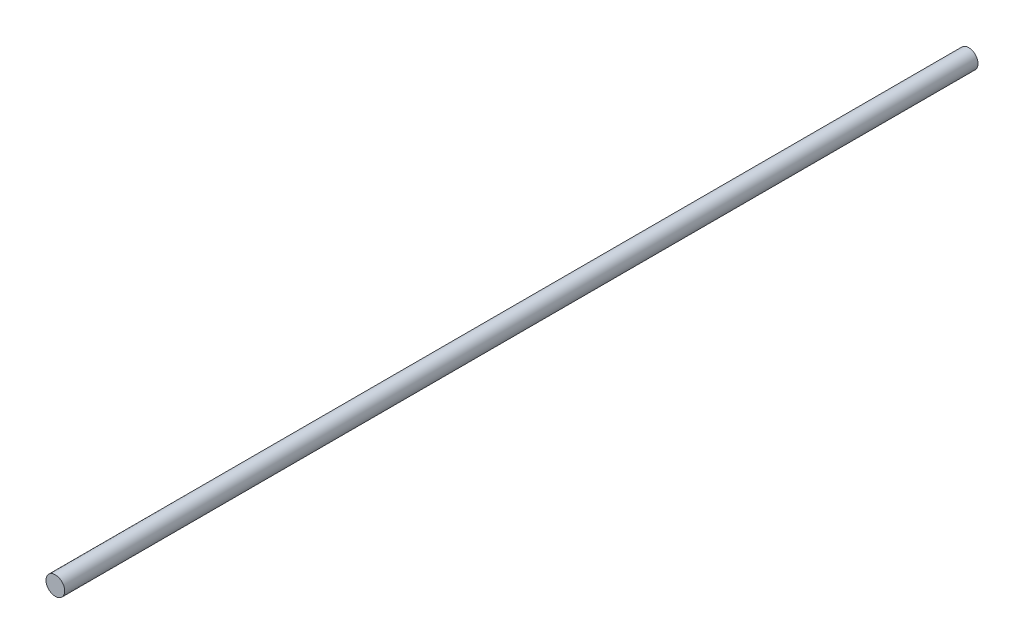
ISO-10303-21;
HEADER;
FILE_DESCRIPTION(('STEP AP214'),'2;1');
FILE_NAME('part.step','',(''),(''),'','','');
FILE_SCHEMA(('AUTOMOTIVE_DESIGN { 1 0 10303 214 1 1 1 1 }'));
ENDSEC;
DATA;
#1=APPLICATION_CONTEXT('core data for automotive mechanical design processes');
#2=APPLICATION_PROTOCOL_DEFINITION('international standard','automotive_design',2000,#1);
#3=PRODUCT_CONTEXT('',#1,'mechanical');
#4=PRODUCT('Part','Part','',(#3));
#5=PRODUCT_RELATED_PRODUCT_CATEGORY('part','',(#4));
#6=PRODUCT_DEFINITION_FORMATION('','',#4);
#7=PRODUCT_DEFINITION_CONTEXT('part definition',#1,'design');
#8=PRODUCT_DEFINITION('design','',#6,#7);
#9=PRODUCT_DEFINITION_SHAPE('','',#8);
#10=(LENGTH_UNIT() NAMED_UNIT(*) SI_UNIT(.MILLI.,.METRE.));
#11=(NAMED_UNIT(*) PLANE_ANGLE_UNIT() SI_UNIT($,.RADIAN.));
#12=(NAMED_UNIT(*) SI_UNIT($,.STERADIAN.) SOLID_ANGLE_UNIT());
#13=UNCERTAINTY_MEASURE_WITH_UNIT(LENGTH_MEASURE(1.E-05),#10,'distance_accuracy_value','');
#14=(GEOMETRIC_REPRESENTATION_CONTEXT(3) GLOBAL_UNCERTAINTY_ASSIGNED_CONTEXT((#13)) GLOBAL_UNIT_ASSIGNED_CONTEXT((#10,
#11,#12)) REPRESENTATION_CONTEXT('',''));
#15=CARTESIAN_POINT('',(0.,0.,0.));
#16=DIRECTION('',(0.,0.,1.));
#17=DIRECTION('',(1.,0.,0.));
#18=AXIS2_PLACEMENT_3D('',#15,#16,#17);
#19=CARTESIAN_POINT('',(0.,0.,195.));
#20=DIRECTION('',(0.,0.,-1.));
#21=DIRECTION('',(-1.,0.,0.));
#22=AXIS2_PLACEMENT_3D('',#19,#20,#21);
#23=CYLINDRICAL_SURFACE('',#22,4.);
#24=CARTESIAN_POINT('',(0.,0.,195.));
#25=DIRECTION('',(0.,0.,1.));
#26=DIRECTION('',(1.,0.,0.));
#27=AXIS2_PLACEMENT_3D('',#24,#25,#26);
#28=CIRCLE('',#27,4.);
#29=CARTESIAN_POINT('',(4.,0.,195.));
#30=VERTEX_POINT('',#29);
#31=EDGE_CURVE('E10',#30,#30,#28,.T.);
#32=ORIENTED_EDGE('',*,*,#31,.F.);
#33=EDGE_LOOP('',(#32));
#34=FACE_BOUND('',#33,.T.);
#35=CARTESIAN_POINT('',(0.,0.,-195.));
#36=DIRECTION('',(0.,0.,1.));
#37=DIRECTION('',(1.,0.,0.));
#38=AXIS2_PLACEMENT_3D('',#35,#36,#37);
#39=CIRCLE('',#38,4.);
#40=CARTESIAN_POINT('',(4.,0.,-195.));
#41=VERTEX_POINT('',#40);
#42=EDGE_CURVE('E35',#41,#41,#39,.T.);
#43=ORIENTED_EDGE('',*,*,#42,.T.);
#44=EDGE_LOOP('',(#43));
#45=FACE_BOUND('',#44,.T.);
#46=ADVANCED_FACE('F32',(#34,#45),#23,.T.);
#47=CARTESIAN_POINT('',(0.,0.,195.));
#48=DIRECTION('',(0.,0.,1.));
#49=DIRECTION('',(1.,0.,0.));
#50=AXIS2_PLACEMENT_3D('',#47,#48,#49);
#51=PLANE('',#50);
#52=ORIENTED_EDGE('',*,*,#31,.T.);
#53=EDGE_LOOP('',(#52));
#54=FACE_BOUND('',#53,.T.);
#55=ADVANCED_FACE('F47',(#54),#51,.T.);
#56=CARTESIAN_POINT('',(0.,0.,-195.));
#57=DIRECTION('',(0.,0.,1.));
#58=DIRECTION('',(1.,0.,0.));
#59=AXIS2_PLACEMENT_3D('',#56,#57,#58);
#60=PLANE('',#59);
#61=ORIENTED_EDGE('',*,*,#42,.F.);
#62=EDGE_LOOP('',(#61));
#63=FACE_BOUND('',#62,.T.);
#64=ADVANCED_FACE('F45',(#63),#60,.F.);
#65=CLOSED_SHELL('',(#46,#55,#64));
#66=MANIFOLD_SOLID_BREP('B2',#65);
#67=ADVANCED_BREP_SHAPE_REPRESENTATION('',(#18,#66),#14);
#68=SHAPE_DEFINITION_REPRESENTATION(#9,#67);
ENDSEC;
END-ISO-10303-21;
